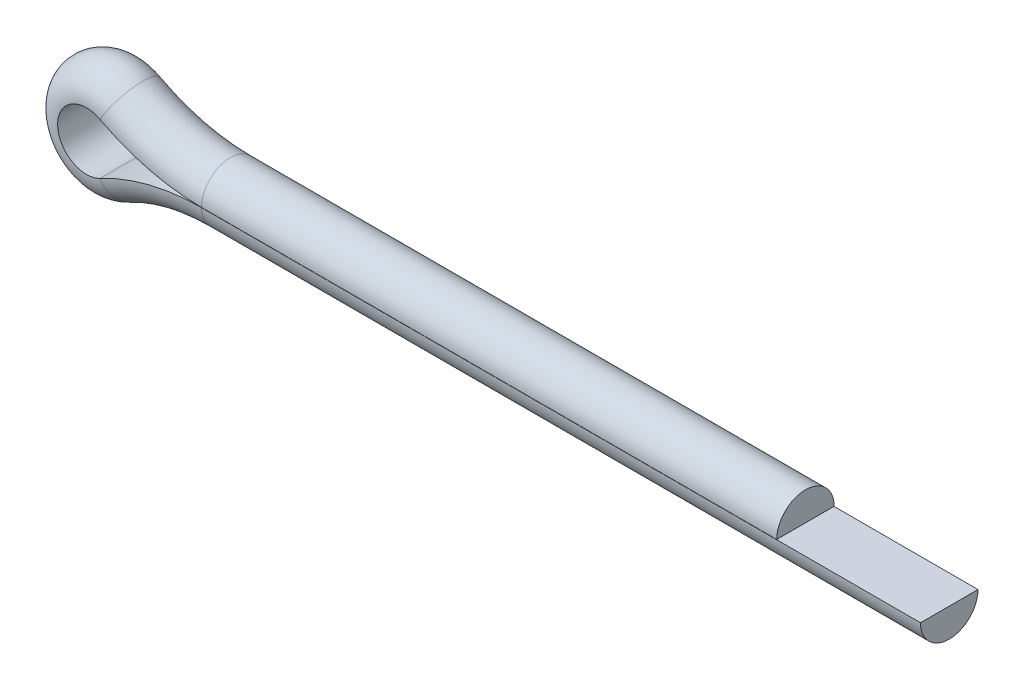
ISO-10303-21;
HEADER;
FILE_DESCRIPTION(('STEP AP214'),'2;1');
FILE_NAME('part.step','',(''),(''),'','','');
FILE_SCHEMA(('AUTOMOTIVE_DESIGN { 1 0 10303 214 1 1 1 1 }'));
ENDSEC;
DATA;
#1=APPLICATION_CONTEXT('core data for automotive mechanical design processes');
#2=APPLICATION_PROTOCOL_DEFINITION('international standard','automotive_design',2000,#1);
#3=PRODUCT_CONTEXT('',#1,'mechanical');
#4=PRODUCT('Part','Part','',(#3));
#5=PRODUCT_RELATED_PRODUCT_CATEGORY('part','',(#4));
#6=PRODUCT_DEFINITION_FORMATION('','',#4);
#7=PRODUCT_DEFINITION_CONTEXT('part definition',#1,'design');
#8=PRODUCT_DEFINITION('design','',#6,#7);
#9=PRODUCT_DEFINITION_SHAPE('','',#8);
#10=(LENGTH_UNIT() NAMED_UNIT(*) SI_UNIT(.MILLI.,.METRE.));
#11=(NAMED_UNIT(*) PLANE_ANGLE_UNIT() SI_UNIT($,.RADIAN.));
#12=(NAMED_UNIT(*) SI_UNIT($,.STERADIAN.) SOLID_ANGLE_UNIT());
#13=UNCERTAINTY_MEASURE_WITH_UNIT(LENGTH_MEASURE(1.E-05),#10,'distance_accuracy_value','');
#14=(GEOMETRIC_REPRESENTATION_CONTEXT(3) GLOBAL_UNCERTAINTY_ASSIGNED_CONTEXT((#13)) GLOBAL_UNIT_ASSIGNED_CONTEXT((#10,
#11,#12)) REPRESENTATION_CONTEXT('',''));
#15=CARTESIAN_POINT('',(0.,0.,0.));
#16=DIRECTION('',(0.,0.,1.));
#17=DIRECTION('',(1.,0.,0.));
#18=AXIS2_PLACEMENT_3D('',#15,#16,#17);
#19=CARTESIAN_POINT('',(0.,-0.00199999999999999,0.499995999984));
#20=DIRECTION('',(0.,-1.,0.));
#21=DIRECTION('',(1.,0.,0.));
#22=AXIS2_PLACEMENT_3D('',#19,#20,#21);
#23=PLANE('',#22);
#24=DIRECTION('',(0.,0.,-1.));
#25=VECTOR('',#24,1.);
#26=CARTESIAN_POINT('',(0.,-0.00199999999999999,0.499995999984));
#27=LINE('',#26,#25);
#28=CARTESIAN_POINT('',(0.,-0.00199999999999999,0.499995999984));
#29=VERTEX_POINT('',#28);
#30=CARTESIAN_POINT('',(0.,-0.00199999999999999,-0.499995999984));
#31=VERTEX_POINT('',#30);
#32=EDGE_CURVE('E139',#29,#31,#27,.T.);
#33=ORIENTED_EDGE('',*,*,#32,.F.);
#34=DIRECTION('',(1.,0.,0.));
#35=VECTOR('',#34,1.);
#36=CARTESIAN_POINT('',(0.,-0.00199999999999999,0.499995999984));
#37=LINE('',#36,#35);
#38=CARTESIAN_POINT('',(12.5,-0.00200000000000043,0.499995999984));
#39=VERTEX_POINT('',#38);
#40=EDGE_CURVE('E39',#29,#39,#37,.T.);
#41=ORIENTED_EDGE('',*,*,#40,.T.);
#42=DIRECTION('',(0.,0.,-1.));
#43=VECTOR('',#42,1.);
#44=CARTESIAN_POINT('',(12.5,-0.00200000000000043,0.499995999984));
#45=LINE('',#44,#43);
#46=CARTESIAN_POINT('',(12.5,-0.00200000000000043,-0.499995999984));
#47=VERTEX_POINT('',#46);
#48=EDGE_CURVE('E46',#39,#47,#45,.T.);
#49=ORIENTED_EDGE('',*,*,#48,.T.);
#50=DIRECTION('',(1.,0.,0.));
#51=VECTOR('',#50,1.);
#52=CARTESIAN_POINT('',(0.,-0.00199999999999999,-0.499995999984));
#53=LINE('',#52,#51);
#54=EDGE_CURVE('E11',#31,#47,#53,.T.);
#55=ORIENTED_EDGE('',*,*,#54,.F.);
#56=EDGE_LOOP('',(#33,#41,#49,#55));
#57=FACE_BOUND('',#56,.T.);
#58=ADVANCED_FACE('F32',(#57),#23,.F.);
#59=CARTESIAN_POINT('',(0.,0.,0.));
#60=DIRECTION('',(1.,0.,0.));
#61=DIRECTION('',(0.,1.,0.));
#62=AXIS2_PLACEMENT_3D('',#59,#60,#61);
#63=CYLINDRICAL_SURFACE('',#62,0.5);
#64=CARTESIAN_POINT('',(0.,0.,0.));
#65=DIRECTION('',(-1.,0.,0.));
#66=DIRECTION('',(0.,0.,-1.));
#67=AXIS2_PLACEMENT_3D('',#64,#65,#66);
#68=CIRCLE('',#67,0.5);
#69=EDGE_CURVE('E136',#31,#29,#68,.T.);
#70=ORIENTED_EDGE('',*,*,#69,.F.);
#71=ORIENTED_EDGE('',*,*,#54,.T.);
#72=CARTESIAN_POINT('',(12.5,0.,0.));
#73=DIRECTION('',(-1.,0.,0.));
#74=DIRECTION('',(0.,0.,-1.));
#75=AXIS2_PLACEMENT_3D('',#72,#73,#74);
#76=CIRCLE('',#75,0.5);
#77=EDGE_CURVE('E52',#47,#39,#76,.T.);
#78=ORIENTED_EDGE('',*,*,#77,.T.);
#79=ORIENTED_EDGE('',*,*,#40,.F.);
#80=EDGE_LOOP('',(#70,#71,#78,#79));
#81=FACE_BOUND('',#80,.T.);
#82=ADVANCED_FACE('F151',(#81),#63,.T.);
#83=CARTESIAN_POINT('',(0.,-3.74999999999999,0.));
#84=DIRECTION('',(0.,0.,-1.));
#85=DIRECTION('',(-1.,0.,0.));
#86=AXIS2_PLACEMENT_3D('',#83,#84,#85);
#87=CYLINDRICAL_SURFACE('',#86,3.74799999999999);
#88=DIRECTION('',(0.,0.,-1.));
#89=VECTOR('',#88,1.);
#90=CARTESIAN_POINT('',(-1.76376470588235,-0.442941176470586,0.499995999984));
#91=LINE('',#90,#89);
#92=CARTESIAN_POINT('',(-1.76376470588235,-0.442941176470586,0.499995999984));
#93=VERTEX_POINT('',#92);
#94=CARTESIAN_POINT('',(-1.76376470588235,-0.442941176470586,-0.499995999984));
#95=VERTEX_POINT('',#94);
#96=EDGE_CURVE('E127',#93,#95,#91,.T.);
#97=ORIENTED_EDGE('',*,*,#96,.F.);
#98=CARTESIAN_POINT('',(0.,-3.74999999999999,0.499995999984));
#99=DIRECTION('',(0.,0.,-1.));
#100=DIRECTION('',(-1.,0.,0.));
#101=AXIS2_PLACEMENT_3D('',#98,#99,#100);
#102=CIRCLE('',#101,3.74799999999999);
#103=EDGE_CURVE('E142',#93,#29,#102,.T.);
#104=ORIENTED_EDGE('',*,*,#103,.T.);
#105=ORIENTED_EDGE('',*,*,#32,.T.);
#106=CARTESIAN_POINT('',(0.,-3.74999999999999,-0.499995999984));
#107=DIRECTION('',(0.,0.,-1.));
#108=DIRECTION('',(-1.,0.,0.));
#109=AXIS2_PLACEMENT_3D('',#106,#107,#108);
#110=CIRCLE('',#109,3.74799999999999);
#111=EDGE_CURVE('E145',#95,#31,#110,.T.);
#112=ORIENTED_EDGE('',*,*,#111,.F.);
#113=EDGE_LOOP('',(#97,#104,#105,#112));
#114=FACE_BOUND('',#113,.T.);
#115=ADVANCED_FACE('F155',(#114),#87,.T.);
#116=CARTESIAN_POINT('',(0.,-3.74999999999999,0.));
#117=DIRECTION('',(0.,0.,-1.));
#118=DIRECTION('',(-1.,0.,0.));
#119=AXIS2_PLACEMENT_3D('',#116,#117,#118);
#120=TOROIDAL_SURFACE('',#119,3.74999999999999,0.5);
#121=CARTESIAN_POINT('',(-1.76470588235293,-0.441176470588232,0.));
#122=DIRECTION('',(-0.882352941176463,-0.470588235294131,0.));
#123=DIRECTION('',(0.,0.,-1.));
#124=AXIS2_PLACEMENT_3D('',#121,#122,#123);
#125=CIRCLE('',#124,0.5);
#126=EDGE_CURVE('E124',#95,#93,#125,.T.);
#127=ORIENTED_EDGE('',*,*,#126,.F.);
#128=ORIENTED_EDGE('',*,*,#111,.T.);
#129=ORIENTED_EDGE('',*,*,#69,.T.);
#130=ORIENTED_EDGE('',*,*,#103,.F.);
#131=EDGE_LOOP('',(#127,#128,#129,#130));
#132=FACE_BOUND('',#131,.T.);
#133=ADVANCED_FACE('F157',(#132),#120,.T.);
#134=CARTESIAN_POINT('',(-2.,0.,0.));
#135=DIRECTION('',(0.,0.,1.));
#136=DIRECTION('',(1.,0.,0.));
#137=AXIS2_PLACEMENT_3D('',#134,#135,#136);
#138=CYLINDRICAL_SURFACE('',#137,0.502000000000001);
#139=DIRECTION('',(0.,0.,-1.));
#140=VECTOR('',#139,1.);
#141=CARTESIAN_POINT('',(-1.76376470588235,0.442941176470589,0.499995999984));
#142=LINE('',#141,#140);
#143=CARTESIAN_POINT('',(-1.76376470588235,0.442941176470589,0.499995999984));
#144=VERTEX_POINT('',#143);
#145=CARTESIAN_POINT('',(-1.76376470588235,0.442941176470589,-0.499995999984));
#146=VERTEX_POINT('',#145);
#147=EDGE_CURVE('E96',#144,#146,#142,.T.);
#148=ORIENTED_EDGE('',*,*,#147,.F.);
#149=CARTESIAN_POINT('',(-2.,0.,0.499995999984));
#150=DIRECTION('',(0.,0.,1.));
#151=DIRECTION('',(1.,0.,0.));
#152=AXIS2_PLACEMENT_3D('',#149,#150,#151);
#153=CIRCLE('',#152,0.502000000000001);
#154=EDGE_CURVE('E130',#144,#93,#153,.T.);
#155=ORIENTED_EDGE('',*,*,#154,.T.);
#156=ORIENTED_EDGE('',*,*,#96,.T.);
#157=CARTESIAN_POINT('',(-2.,0.,-0.499995999984));
#158=DIRECTION('',(0.,0.,1.));
#159=DIRECTION('',(1.,0.,0.));
#160=AXIS2_PLACEMENT_3D('',#157,#158,#159);
#161=CIRCLE('',#160,0.502000000000001);
#162=EDGE_CURVE('E133',#146,#95,#161,.T.);
#163=ORIENTED_EDGE('',*,*,#162,.F.);
#164=EDGE_LOOP('',(#148,#155,#156,#163));
#165=FACE_BOUND('',#164,.T.);
#166=ADVANCED_FACE('F161',(#165),#138,.F.);
#167=CARTESIAN_POINT('',(-2.,0.,0.));
#168=DIRECTION('',(0.,0.,1.));
#169=DIRECTION('',(1.,0.,0.));
#170=AXIS2_PLACEMENT_3D('',#167,#168,#169);
#171=TOROIDAL_SURFACE('',#170,0.500000000000001,0.5);
#172=CARTESIAN_POINT('',(-1.76470588235294,0.441176470588236,0.));
#173=DIRECTION('',(0.88235294117647,-0.470588235294118,0.));
#174=DIRECTION('',(0.,0.,-1.));
#175=AXIS2_PLACEMENT_3D('',#172,#173,#174);
#176=CIRCLE('',#175,0.5);
#177=EDGE_CURVE('E92',#146,#144,#176,.T.);
#178=ORIENTED_EDGE('',*,*,#177,.F.);
#179=ORIENTED_EDGE('',*,*,#162,.T.);
#180=ORIENTED_EDGE('',*,*,#126,.T.);
#181=ORIENTED_EDGE('',*,*,#154,.F.);
#182=EDGE_LOOP('',(#178,#179,#180,#181));
#183=FACE_BOUND('',#182,.T.);
#184=ADVANCED_FACE('F162',(#183),#171,.T.);
#185=CARTESIAN_POINT('',(0.,3.74999999999999,0.));
#186=DIRECTION('',(0.,0.,-1.));
#187=DIRECTION('',(-1.,0.,0.));
#188=AXIS2_PLACEMENT_3D('',#185,#186,#187);
#189=CYLINDRICAL_SURFACE('',#188,3.74799999999999);
#190=DIRECTION('',(0.,0.,-1.));
#191=VECTOR('',#190,1.);
#192=CARTESIAN_POINT('',(0.,0.00200000000000011,0.499995999984));
#193=LINE('',#192,#191);
#194=CARTESIAN_POINT('',(0.,0.00200000000000011,0.499995999984));
#195=VERTEX_POINT('',#194);
#196=CARTESIAN_POINT('',(0.,0.00200000000000011,-0.499995999984));
#197=VERTEX_POINT('',#196);
#198=EDGE_CURVE('E99',#195,#197,#193,.T.);
#199=ORIENTED_EDGE('',*,*,#198,.F.);
#200=CARTESIAN_POINT('',(0.,3.74999999999999,0.499995999984));
#201=DIRECTION('',(0.,0.,-1.));
#202=DIRECTION('',(-1.,0.,0.));
#203=AXIS2_PLACEMENT_3D('',#200,#201,#202);
#204=CIRCLE('',#203,3.74799999999999);
#205=EDGE_CURVE('E84',#195,#144,#204,.T.);
#206=ORIENTED_EDGE('',*,*,#205,.T.);
#207=ORIENTED_EDGE('',*,*,#147,.T.);
#208=CARTESIAN_POINT('',(0.,3.74999999999999,-0.499995999984));
#209=DIRECTION('',(0.,0.,-1.));
#210=DIRECTION('',(-1.,0.,0.));
#211=AXIS2_PLACEMENT_3D('',#208,#209,#210);
#212=CIRCLE('',#211,3.74799999999999);
#213=EDGE_CURVE('E95',#197,#146,#212,.T.);
#214=ORIENTED_EDGE('',*,*,#213,.F.);
#215=EDGE_LOOP('',(#199,#206,#207,#214));
#216=FACE_BOUND('',#215,.T.);
#217=ADVANCED_FACE('F101',(#216),#189,.T.);
#218=CARTESIAN_POINT('',(0.,3.74999999999999,0.));
#219=DIRECTION('',(0.,0.,-1.));
#220=DIRECTION('',(-1.,0.,0.));
#221=AXIS2_PLACEMENT_3D('',#218,#219,#220);
#222=TOROIDAL_SURFACE('',#221,3.74999999999999,0.5);
#223=CARTESIAN_POINT('',(0.,0.,0.));
#224=DIRECTION('',(1.,0.,0.));
#225=DIRECTION('',(0.,0.,-1.));
#226=AXIS2_PLACEMENT_3D('',#223,#224,#225);
#227=CIRCLE('',#226,0.5);
#228=EDGE_CURVE('E89',#197,#195,#227,.T.);
#229=ORIENTED_EDGE('',*,*,#228,.F.);
#230=ORIENTED_EDGE('',*,*,#213,.T.);
#231=ORIENTED_EDGE('',*,*,#177,.T.);
#232=ORIENTED_EDGE('',*,*,#205,.F.);
#233=EDGE_LOOP('',(#229,#230,#231,#232));
#234=FACE_BOUND('',#233,.T.);
#235=ADVANCED_FACE('F86',(#234),#222,.T.);
#236=CARTESIAN_POINT('',(0.,0.,0.));
#237=DIRECTION('',(1.,0.,0.));
#238=DIRECTION('',(0.,1.,0.));
#239=AXIS2_PLACEMENT_3D('',#236,#237,#238);
#240=CYLINDRICAL_SURFACE('',#239,0.5);
#241=CARTESIAN_POINT('',(10.,0.,0.));
#242=DIRECTION('',(1.,0.,0.));
#243=DIRECTION('',(0.,0.,-1.));
#244=AXIS2_PLACEMENT_3D('',#241,#242,#243);
#245=CIRCLE('',#244,0.5);
#246=CARTESIAN_POINT('',(10.,0.002,-0.499995999984));
#247=VERTEX_POINT('',#246);
#248=CARTESIAN_POINT('',(10.,0.002,0.499995999984));
#249=VERTEX_POINT('',#248);
#250=EDGE_CURVE('E116',#247,#249,#245,.T.);
#251=ORIENTED_EDGE('',*,*,#250,.F.);
#252=DIRECTION('',(1.,0.,0.));
#253=VECTOR('',#252,1.);
#254=CARTESIAN_POINT('',(0.,0.00200000000000011,-0.499995999984));
#255=LINE('',#254,#253);
#256=EDGE_CURVE('E112',#197,#247,#255,.T.);
#257=ORIENTED_EDGE('',*,*,#256,.F.);
#258=ORIENTED_EDGE('',*,*,#228,.T.);
#259=DIRECTION('',(1.,0.,0.));
#260=VECTOR('',#259,1.);
#261=CARTESIAN_POINT('',(0.,0.00200000000000011,0.499995999984));
#262=LINE('',#261,#260);
#263=EDGE_CURVE('E103',#195,#249,#262,.T.);
#264=ORIENTED_EDGE('',*,*,#263,.T.);
#265=EDGE_LOOP('',(#251,#257,#258,#264));
#266=FACE_BOUND('',#265,.T.);
#267=ADVANCED_FACE('F114',(#266),#240,.T.);
#268=CARTESIAN_POINT('',(0.,0.00200000000000011,0.499995999984));
#269=DIRECTION('',(0.,-1.,0.));
#270=DIRECTION('',(1.,0.,0.));
#271=AXIS2_PLACEMENT_3D('',#268,#269,#270);
#272=PLANE('',#271);
#273=DIRECTION('',(0.,0.,-1.));
#274=VECTOR('',#273,1.);
#275=CARTESIAN_POINT('',(10.,0.002,0.499995999984));
#276=LINE('',#275,#274);
#277=EDGE_CURVE('E108',#249,#247,#276,.T.);
#278=ORIENTED_EDGE('',*,*,#277,.F.);
#279=ORIENTED_EDGE('',*,*,#263,.F.);
#280=ORIENTED_EDGE('',*,*,#198,.T.);
#281=ORIENTED_EDGE('',*,*,#256,.T.);
#282=EDGE_LOOP('',(#278,#279,#280,#281));
#283=FACE_BOUND('',#282,.T.);
#284=ADVANCED_FACE('F106',(#283),#272,.T.);
#285=CARTESIAN_POINT('',(12.5,0.,0.));
#286=DIRECTION('',(-1.,0.,0.));
#287=DIRECTION('',(0.,0.,-1.));
#288=AXIS2_PLACEMENT_3D('',#285,#286,#287);
#289=PLANE('',#288);
#290=ORIENTED_EDGE('',*,*,#77,.F.);
#291=ORIENTED_EDGE('',*,*,#48,.F.);
#292=EDGE_LOOP('',(#290,#291));
#293=FACE_BOUND('',#292,.T.);
#294=ADVANCED_FACE('F224',(#293),#289,.F.);
#295=CARTESIAN_POINT('',(10.,0.,0.));
#296=DIRECTION('',(1.,0.,0.));
#297=DIRECTION('',(0.,0.,-1.));
#298=AXIS2_PLACEMENT_3D('',#295,#296,#297);
#299=PLANE('',#298);
#300=ORIENTED_EDGE('',*,*,#250,.T.);
#301=ORIENTED_EDGE('',*,*,#277,.T.);
#302=EDGE_LOOP('',(#300,#301));
#303=FACE_BOUND('',#302,.T.);
#304=ADVANCED_FACE('F233',(#303),#299,.T.);
#305=CLOSED_SHELL('',(#58,#82,#115,#133,#166,#184,#217,#235,#267,#284,#294,#304));
#306=MANIFOLD_SOLID_BREP('B2',#305);
#307=ADVANCED_BREP_SHAPE_REPRESENTATION('',(#18,#306),#14);
#308=SHAPE_DEFINITION_REPRESENTATION(#9,#307);
ENDSEC;
END-ISO-10303-21;
